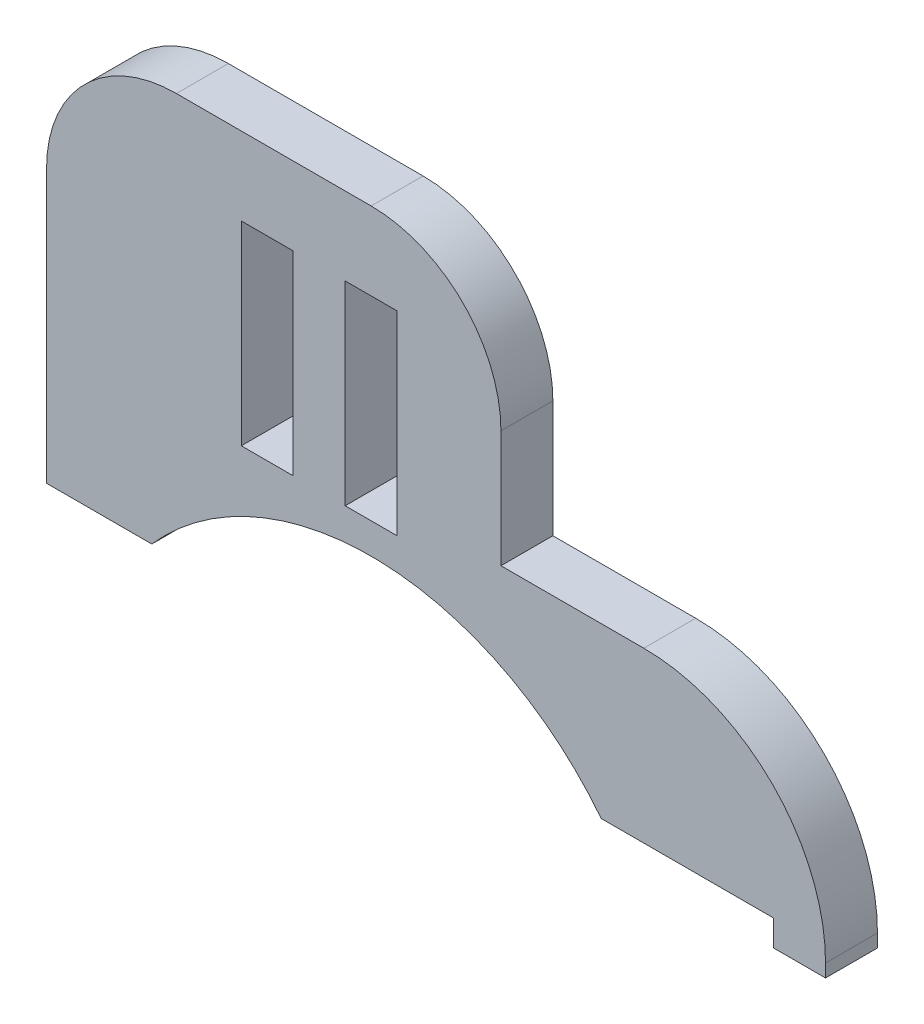
ISO-10303-21;
HEADER;
FILE_DESCRIPTION(('STEP AP214'),'2;1');
FILE_NAME('part.step','',(''),(''),'','','');
FILE_SCHEMA(('AUTOMOTIVE_DESIGN { 1 0 10303 214 1 1 1 1 }'));
ENDSEC;
DATA;
#1=APPLICATION_CONTEXT('core data for automotive mechanical design processes');
#2=APPLICATION_PROTOCOL_DEFINITION('international standard','automotive_design',2000,#1);
#3=PRODUCT_CONTEXT('',#1,'mechanical');
#4=PRODUCT('Part','Part','',(#3));
#5=PRODUCT_RELATED_PRODUCT_CATEGORY('part','',(#4));
#6=PRODUCT_DEFINITION_FORMATION('','',#4);
#7=PRODUCT_DEFINITION_CONTEXT('part definition',#1,'design');
#8=PRODUCT_DEFINITION('design','',#6,#7);
#9=PRODUCT_DEFINITION_SHAPE('','',#8);
#10=(LENGTH_UNIT() NAMED_UNIT(*) SI_UNIT(.MILLI.,.METRE.));
#11=(NAMED_UNIT(*) PLANE_ANGLE_UNIT() SI_UNIT($,.RADIAN.));
#12=(NAMED_UNIT(*) SI_UNIT($,.STERADIAN.) SOLID_ANGLE_UNIT());
#13=UNCERTAINTY_MEASURE_WITH_UNIT(LENGTH_MEASURE(1.E-05),#10,'distance_accuracy_value','');
#14=(GEOMETRIC_REPRESENTATION_CONTEXT(3) GLOBAL_UNCERTAINTY_ASSIGNED_CONTEXT((#13)) GLOBAL_UNIT_ASSIGNED_CONTEXT((#10,
#11,#12)) REPRESENTATION_CONTEXT('',''));
#15=CARTESIAN_POINT('',(0.,0.,0.));
#16=DIRECTION('',(0.,0.,1.));
#17=DIRECTION('',(1.,0.,0.));
#18=AXIS2_PLACEMENT_3D('',#15,#16,#17);
#19=CARTESIAN_POINT('',(-38.1,-7.62,5.08));
#20=DIRECTION('',(0.,1.,0.));
#21=DIRECTION('',(0.,0.,1.));
#22=AXIS2_PLACEMENT_3D('',#19,#20,#21);
#23=PLANE('',#22);
#24=DIRECTION('',(1.,0.,0.));
#25=VECTOR('',#24,1.);
#26=CARTESIAN_POINT('',(-38.1,-7.62,0.));
#27=LINE('',#26,#25);
#28=CARTESIAN_POINT('',(-38.1,-7.62,0.));
#29=VERTEX_POINT('',#28);
#30=CARTESIAN_POINT('',(-27.8037875443941,-7.62000000000001,0.));
#31=VERTEX_POINT('',#30);
#32=EDGE_CURVE('E307',#29,#31,#27,.T.);
#33=ORIENTED_EDGE('',*,*,#32,.T.);
#34=DIRECTION('',(0.,0.,1.));
#35=VECTOR('',#34,1.);
#36=CARTESIAN_POINT('',(-27.8037875443941,-7.62,0.));
#37=LINE('',#36,#35);
#38=CARTESIAN_POINT('',(-27.8037875443941,-7.62,5.08));
#39=VERTEX_POINT('',#38);
#40=EDGE_CURVE('E206',#31,#39,#37,.T.);
#41=ORIENTED_EDGE('',*,*,#40,.T.);
#42=DIRECTION('',(1.,0.,0.));
#43=VECTOR('',#42,1.);
#44=CARTESIAN_POINT('',(-38.1,-7.62,5.08));
#45=LINE('',#44,#43);
#46=CARTESIAN_POINT('',(-38.1,-7.62,5.08));
#47=VERTEX_POINT('',#46);
#48=EDGE_CURVE('E197',#47,#39,#45,.T.);
#49=ORIENTED_EDGE('',*,*,#48,.F.);
#50=DIRECTION('',(0.,0.,-1.));
#51=VECTOR('',#50,1.);
#52=CARTESIAN_POINT('',(-38.1,-7.62,5.08));
#53=LINE('',#52,#51);
#54=EDGE_CURVE('E312',#47,#29,#53,.T.);
#55=ORIENTED_EDGE('',*,*,#54,.T.);
#56=EDGE_LOOP('',(#33,#41,#49,#55));
#57=FACE_BOUND('',#56,.T.);
#58=ADVANCED_FACE('F35',(#57),#23,.F.);
#59=CARTESIAN_POINT('',(33.02,-11.43,0.));
#60=DIRECTION('',(1.,0.,0.));
#61=DIRECTION('',(0.,0.,-1.));
#62=AXIS2_PLACEMENT_3D('',#59,#60,#61);
#63=PLANE('',#62);
#64=DIRECTION('',(0.,0.,1.));
#65=VECTOR('',#64,1.);
#66=CARTESIAN_POINT('',(33.02,-8.89,5.08));
#67=LINE('',#66,#65);
#68=CARTESIAN_POINT('',(33.02,-8.89,0.));
#69=VERTEX_POINT('',#68);
#70=CARTESIAN_POINT('',(33.02,-8.89,5.08));
#71=VERTEX_POINT('',#70);
#72=EDGE_CURVE('E201',#69,#71,#67,.T.);
#73=ORIENTED_EDGE('',*,*,#72,.F.);
#74=DIRECTION('',(0.,1.,0.));
#75=VECTOR('',#74,1.);
#76=CARTESIAN_POINT('',(33.02,-11.43,0.));
#77=LINE('',#76,#75);
#78=CARTESIAN_POINT('',(33.02,-11.43,0.));
#79=VERTEX_POINT('',#78);
#80=EDGE_CURVE('E219',#79,#69,#77,.T.);
#81=ORIENTED_EDGE('',*,*,#80,.F.);
#82=DIRECTION('',(0.,0.,-1.));
#83=VECTOR('',#82,1.);
#84=CARTESIAN_POINT('',(33.02,-11.43,0.));
#85=LINE('',#84,#83);
#86=CARTESIAN_POINT('',(33.02,-11.43,5.08));
#87=VERTEX_POINT('',#86);
#88=EDGE_CURVE('E214',#87,#79,#85,.T.);
#89=ORIENTED_EDGE('',*,*,#88,.F.);
#90=DIRECTION('',(0.,1.,0.));
#91=VECTOR('',#90,1.);
#92=CARTESIAN_POINT('',(33.02,-11.43,5.08));
#93=LINE('',#92,#91);
#94=EDGE_CURVE('E222',#87,#71,#93,.T.);
#95=ORIENTED_EDGE('',*,*,#94,.T.);
#96=EDGE_LOOP('',(#73,#81,#89,#95));
#97=FACE_BOUND('',#96,.T.);
#98=ADVANCED_FACE('F379',(#97),#63,.F.);
#99=CARTESIAN_POINT('',(-38.1,7.62,5.08));
#100=DIRECTION('',(0.,-1.,0.));
#101=DIRECTION('',(0.,0.,-1.));
#102=AXIS2_PLACEMENT_3D('',#99,#100,#101);
#103=PLANE('',#102);
#104=DIRECTION('',(-1.,0.,0.));
#105=VECTOR('',#104,1.);
#106=CARTESIAN_POINT('',(-38.1,7.62,5.08));
#107=LINE('',#106,#105);
#108=CARTESIAN_POINT('',(20.32,7.62,5.08));
#109=VERTEX_POINT('',#108);
#110=CARTESIAN_POINT('',(6.35,7.62,5.08));
#111=VERTEX_POINT('',#110);
#112=EDGE_CURVE('E306',#109,#111,#107,.T.);
#113=ORIENTED_EDGE('',*,*,#112,.F.);
#114=DIRECTION('',(0.,0.,-1.));
#115=VECTOR('',#114,1.);
#116=CARTESIAN_POINT('',(20.32,7.62,5.08));
#117=LINE('',#116,#115);
#118=CARTESIAN_POINT('',(20.32,7.62,0.));
#119=VERTEX_POINT('',#118);
#120=EDGE_CURVE('E185',#109,#119,#117,.T.);
#121=ORIENTED_EDGE('',*,*,#120,.T.);
#122=DIRECTION('',(-1.,0.,0.));
#123=VECTOR('',#122,1.);
#124=CARTESIAN_POINT('',(-38.1,7.62,0.));
#125=LINE('',#124,#123);
#126=CARTESIAN_POINT('',(6.35,7.62,0.));
#127=VERTEX_POINT('',#126);
#128=EDGE_CURVE('E314',#119,#127,#125,.T.);
#129=ORIENTED_EDGE('',*,*,#128,.T.);
#130=DIRECTION('',(0.,0.,-1.));
#131=VECTOR('',#130,1.);
#132=CARTESIAN_POINT('',(6.35,7.62,5.08));
#133=LINE('',#132,#131);
#134=EDGE_CURVE('E300',#111,#127,#133,.T.);
#135=ORIENTED_EDGE('',*,*,#134,.F.);
#136=EDGE_LOOP('',(#113,#121,#129,#135));
#137=FACE_BOUND('',#136,.T.);
#138=ADVANCED_FACE('F344',(#137),#103,.F.);
#139=CARTESIAN_POINT('',(38.1,-7.62,5.08));
#140=DIRECTION('',(-1.,0.,0.));
#141=DIRECTION('',(0.,0.,1.));
#142=AXIS2_PLACEMENT_3D('',#139,#140,#141);
#143=PLANE('',#142);
#144=DIRECTION('',(0.,1.,0.));
#145=VECTOR('',#144,1.);
#146=CARTESIAN_POINT('',(38.1,-7.62,0.));
#147=LINE('',#146,#145);
#148=CARTESIAN_POINT('',(38.1,-11.43,0.));
#149=VERTEX_POINT('',#148);
#150=CARTESIAN_POINT('',(38.1,-10.16,0.));
#151=VERTEX_POINT('',#150);
#152=EDGE_CURVE('E303',#149,#151,#147,.T.);
#153=ORIENTED_EDGE('',*,*,#152,.T.);
#154=DIRECTION('',(0.,0.,-1.));
#155=VECTOR('',#154,1.);
#156=CARTESIAN_POINT('',(38.1,-10.16,5.08));
#157=LINE('',#156,#155);
#158=CARTESIAN_POINT('',(38.1,-10.16,5.08));
#159=VERTEX_POINT('',#158);
#160=EDGE_CURVE('E43',#151,#159,#157,.F.);
#161=ORIENTED_EDGE('',*,*,#160,.T.);
#162=DIRECTION('',(0.,1.,0.));
#163=VECTOR('',#162,1.);
#164=CARTESIAN_POINT('',(38.1,-7.62,5.08));
#165=LINE('',#164,#163);
#166=CARTESIAN_POINT('',(38.1,-11.43,5.08));
#167=VERTEX_POINT('',#166);
#168=EDGE_CURVE('E304',#167,#159,#165,.T.);
#169=ORIENTED_EDGE('',*,*,#168,.F.);
#170=DIRECTION('',(0.,0.,1.));
#171=VECTOR('',#170,1.);
#172=CARTESIAN_POINT('',(38.1,-11.43,0.));
#173=LINE('',#172,#171);
#174=EDGE_CURVE('E204',#149,#167,#173,.T.);
#175=ORIENTED_EDGE('',*,*,#174,.F.);
#176=EDGE_LOOP('',(#153,#161,#169,#175));
#177=FACE_BOUND('',#176,.T.);
#178=ADVANCED_FACE('F385',(#177),#143,.F.);
#179=CARTESIAN_POINT('',(-38.1,-7.62,5.08));
#180=DIRECTION('',(1.,0.,0.));
#181=DIRECTION('',(0.,0.,-1.));
#182=AXIS2_PLACEMENT_3D('',#179,#180,#181);
#183=PLANE('',#182);
#184=DIRECTION('',(0.,-1.,0.));
#185=VECTOR('',#184,1.);
#186=CARTESIAN_POINT('',(-38.1,-7.62,5.08));
#187=LINE('',#186,#185);
#188=CARTESIAN_POINT('',(-38.1,19.05,5.08));
#189=VERTEX_POINT('',#188);
#190=EDGE_CURVE('E309',#189,#47,#187,.T.);
#191=ORIENTED_EDGE('',*,*,#190,.F.);
#192=DIRECTION('',(0.,0.,-1.));
#193=VECTOR('',#192,1.);
#194=CARTESIAN_POINT('',(-38.1,19.05,0.));
#195=LINE('',#194,#193);
#196=CARTESIAN_POINT('',(-38.1,19.05,0.));
#197=VERTEX_POINT('',#196);
#198=EDGE_CURVE('E322',#189,#197,#195,.T.);
#199=ORIENTED_EDGE('',*,*,#198,.T.);
#200=DIRECTION('',(0.,-1.,0.));
#201=VECTOR('',#200,1.);
#202=CARTESIAN_POINT('',(-38.1,-7.62,0.));
#203=LINE('',#202,#201);
#204=EDGE_CURVE('E316',#197,#29,#203,.T.);
#205=ORIENTED_EDGE('',*,*,#204,.T.);
#206=ORIENTED_EDGE('',*,*,#54,.F.);
#207=EDGE_LOOP('',(#191,#199,#205,#206));
#208=FACE_BOUND('',#207,.T.);
#209=ADVANCED_FACE('F372',(#208),#183,.F.);
#210=CARTESIAN_POINT('',(0.,0.,5.08));
#211=DIRECTION('',(0.,0.,-1.));
#212=DIRECTION('',(-1.,0.,0.));
#213=AXIS2_PLACEMENT_3D('',#210,#211,#212);
#214=PLANE('',#213);
#215=ORIENTED_EDGE('',*,*,#168,.T.);
#216=CARTESIAN_POINT('',(20.32,-10.16,5.08));
#217=DIRECTION('',(0.,0.,-1.));
#218=DIRECTION('',(-1.,0.,0.));
#219=AXIS2_PLACEMENT_3D('',#216,#217,#218);
#220=CIRCLE('',#219,17.78);
#221=EDGE_CURVE('E11',#159,#109,#220,.F.);
#222=ORIENTED_EDGE('',*,*,#221,.T.);
#223=ORIENTED_EDGE('',*,*,#112,.T.);
#224=DIRECTION('',(0.,-1.,0.));
#225=VECTOR('',#224,1.);
#226=CARTESIAN_POINT('',(6.35,31.75,5.08));
#227=LINE('',#226,#225);
#228=CARTESIAN_POINT('',(6.35,19.05,5.08));
#229=VERTEX_POINT('',#228);
#230=EDGE_CURVE('E294',#229,#111,#227,.T.);
#231=ORIENTED_EDGE('',*,*,#230,.F.);
#232=CARTESIAN_POINT('',(-6.35,19.05,5.08));
#233=DIRECTION('',(0.,0.,-1.));
#234=DIRECTION('',(-1.,0.,0.));
#235=AXIS2_PLACEMENT_3D('',#232,#233,#234);
#236=CIRCLE('',#235,12.7);
#237=CARTESIAN_POINT('',(-6.35,31.75,5.08));
#238=VERTEX_POINT('',#237);
#239=EDGE_CURVE('E334',#229,#238,#236,.F.);
#240=ORIENTED_EDGE('',*,*,#239,.T.);
#241=DIRECTION('',(1.,0.,0.));
#242=VECTOR('',#241,1.);
#243=CARTESIAN_POINT('',(-19.05,31.75,5.08));
#244=LINE('',#243,#242);
#245=CARTESIAN_POINT('',(-25.4,31.75,5.08));
#246=VERTEX_POINT('',#245);
#247=EDGE_CURVE('E291',#246,#238,#244,.T.);
#248=ORIENTED_EDGE('',*,*,#247,.F.);
#249=CARTESIAN_POINT('',(-25.4,19.05,5.08));
#250=DIRECTION('',(0.,0.,-1.));
#251=DIRECTION('',(-1.,0.,0.));
#252=AXIS2_PLACEMENT_3D('',#249,#250,#251);
#253=CIRCLE('',#252,12.7);
#254=EDGE_CURVE('E336',#246,#189,#253,.F.);
#255=ORIENTED_EDGE('',*,*,#254,.T.);
#256=ORIENTED_EDGE('',*,*,#190,.T.);
#257=ORIENTED_EDGE('',*,*,#48,.T.);
#258=CARTESIAN_POINT('',(-6.34999999999998,-26.495,5.08));
#259=DIRECTION('',(0.,0.,1.));
#260=DIRECTION('',(-1.,0.,0.));
#261=AXIS2_PLACEMENT_3D('',#258,#259,#260);
#262=CIRCLE('',#261,28.575);
#263=CARTESIAN_POINT('',(16.1576564750753,-8.89,5.08));
#264=VERTEX_POINT('',#263);
#265=EDGE_CURVE('E178',#264,#39,#262,.T.);
#266=ORIENTED_EDGE('',*,*,#265,.F.);
#267=DIRECTION('',(-1.,0.,0.));
#268=VECTOR('',#267,1.);
#269=CARTESIAN_POINT('',(33.02,-8.89,5.08));
#270=LINE('',#269,#268);
#271=EDGE_CURVE('E194',#71,#264,#270,.T.);
#272=ORIENTED_EDGE('',*,*,#271,.F.);
#273=ORIENTED_EDGE('',*,*,#94,.F.);
#274=DIRECTION('',(-1.,0.,0.));
#275=VECTOR('',#274,1.);
#276=CARTESIAN_POINT('',(38.1,-11.43,5.08));
#277=LINE('',#276,#275);
#278=EDGE_CURVE('E212',#167,#87,#277,.T.);
#279=ORIENTED_EDGE('',*,*,#278,.F.);
#280=EDGE_LOOP('',(#215,#222,#223,#231,#240,#248,#255,#256,#257,#266,#272,#273,#279));
#281=FACE_BOUND('',#280,.T.);
#282=DIRECTION('',(1.,0.,0.));
#283=VECTOR('',#282,1.);
#284=CARTESIAN_POINT('',(0.,24.13,5.08));
#285=LINE('',#284,#283);
#286=CARTESIAN_POINT('',(-19.05,24.13,5.08));
#287=VERTEX_POINT('',#286);
#288=CARTESIAN_POINT('',(-13.97,24.13,5.08));
#289=VERTEX_POINT('',#288);
#290=EDGE_CURVE('E250',#287,#289,#285,.T.);
#291=ORIENTED_EDGE('',*,*,#290,.T.);
#292=DIRECTION('',(0.,-1.,0.));
#293=VECTOR('',#292,1.);
#294=CARTESIAN_POINT('',(-13.97,0.,5.08));
#295=LINE('',#294,#293);
#296=CARTESIAN_POINT('',(-13.97,5.08,5.08));
#297=VERTEX_POINT('',#296);
#298=EDGE_CURVE('E253',#289,#297,#295,.T.);
#299=ORIENTED_EDGE('',*,*,#298,.T.);
#300=DIRECTION('',(-1.,0.,0.));
#301=VECTOR('',#300,1.);
#302=CARTESIAN_POINT('',(0.,5.08,5.08));
#303=LINE('',#302,#301);
#304=CARTESIAN_POINT('',(-19.05,5.08,5.08));
#305=VERTEX_POINT('',#304);
#306=EDGE_CURVE('E238',#297,#305,#303,.T.);
#307=ORIENTED_EDGE('',*,*,#306,.T.);
#308=DIRECTION('',(0.,1.,0.));
#309=VECTOR('',#308,1.);
#310=CARTESIAN_POINT('',(-19.05,0.,5.08));
#311=LINE('',#310,#309);
#312=EDGE_CURVE('E247',#305,#287,#311,.T.);
#313=ORIENTED_EDGE('',*,*,#312,.T.);
#314=EDGE_LOOP('',(#291,#299,#307,#313));
#315=FACE_BOUND('',#314,.T.);
#316=DIRECTION('',(1.,0.,0.));
#317=VECTOR('',#316,1.);
#318=CARTESIAN_POINT('',(0.,24.13,5.08));
#319=LINE('',#318,#317);
#320=CARTESIAN_POINT('',(-8.88999999999998,24.13,5.08));
#321=VERTEX_POINT('',#320);
#322=CARTESIAN_POINT('',(-3.80999999999998,24.13,5.08));
#323=VERTEX_POINT('',#322);
#324=EDGE_CURVE('E282',#321,#323,#319,.T.);
#325=ORIENTED_EDGE('',*,*,#324,.T.);
#326=DIRECTION('',(0.,-1.,0.));
#327=VECTOR('',#326,1.);
#328=CARTESIAN_POINT('',(-3.80999999999999,0.,5.08));
#329=LINE('',#328,#327);
#330=CARTESIAN_POINT('',(-3.80999999999999,5.08,5.08));
#331=VERTEX_POINT('',#330);
#332=EDGE_CURVE('E285',#323,#331,#329,.T.);
#333=ORIENTED_EDGE('',*,*,#332,.T.);
#334=DIRECTION('',(-1.,0.,0.));
#335=VECTOR('',#334,1.);
#336=CARTESIAN_POINT('',(0.,5.08,5.08));
#337=LINE('',#336,#335);
#338=CARTESIAN_POINT('',(-8.88999999999998,5.08,5.08));
#339=VERTEX_POINT('',#338);
#340=EDGE_CURVE('E270',#331,#339,#337,.T.);
#341=ORIENTED_EDGE('',*,*,#340,.T.);
#342=DIRECTION('',(0.,1.,0.));
#343=VECTOR('',#342,1.);
#344=CARTESIAN_POINT('',(-8.88999999999998,0.,5.08));
#345=LINE('',#344,#343);
#346=EDGE_CURVE('E279',#339,#321,#345,.T.);
#347=ORIENTED_EDGE('',*,*,#346,.T.);
#348=EDGE_LOOP('',(#325,#333,#341,#347));
#349=FACE_BOUND('',#348,.T.);
#350=ADVANCED_FACE('F191',(#281,#315,#349),#214,.F.);
#351=CARTESIAN_POINT('',(0.,0.,0.));
#352=DIRECTION('',(0.,0.,-1.));
#353=DIRECTION('',(-1.,0.,0.));
#354=AXIS2_PLACEMENT_3D('',#351,#352,#353);
#355=PLANE('',#354);
#356=ORIENTED_EDGE('',*,*,#128,.F.);
#357=CARTESIAN_POINT('',(20.32,-10.16,0.));
#358=DIRECTION('',(0.,0.,-1.));
#359=DIRECTION('',(-1.,0.,0.));
#360=AXIS2_PLACEMENT_3D('',#357,#358,#359);
#361=CIRCLE('',#360,17.78);
#362=EDGE_CURVE('E57',#119,#151,#361,.T.);
#363=ORIENTED_EDGE('',*,*,#362,.T.);
#364=ORIENTED_EDGE('',*,*,#152,.F.);
#365=DIRECTION('',(1.,0.,0.));
#366=VECTOR('',#365,1.);
#367=CARTESIAN_POINT('',(38.1,-11.43,0.));
#368=LINE('',#367,#366);
#369=EDGE_CURVE('E216',#79,#149,#368,.T.);
#370=ORIENTED_EDGE('',*,*,#369,.F.);
#371=ORIENTED_EDGE('',*,*,#80,.T.);
#372=DIRECTION('',(1.,0.,0.));
#373=VECTOR('',#372,1.);
#374=CARTESIAN_POINT('',(33.02,-8.89,0.));
#375=LINE('',#374,#373);
#376=CARTESIAN_POINT('',(16.1576564750753,-8.89,0.));
#377=VERTEX_POINT('',#376);
#378=EDGE_CURVE('E202',#377,#69,#375,.T.);
#379=ORIENTED_EDGE('',*,*,#378,.F.);
#380=CARTESIAN_POINT('',(-6.34999999999998,-26.495,0.));
#381=DIRECTION('',(0.,0.,1.));
#382=DIRECTION('',(-1.,0.,0.));
#383=AXIS2_PLACEMENT_3D('',#380,#381,#382);
#384=CIRCLE('',#383,28.575);
#385=EDGE_CURVE('E181',#377,#31,#384,.T.);
#386=ORIENTED_EDGE('',*,*,#385,.T.);
#387=ORIENTED_EDGE('',*,*,#32,.F.);
#388=ORIENTED_EDGE('',*,*,#204,.F.);
#389=CARTESIAN_POINT('',(-25.4,19.05,0.));
#390=DIRECTION('',(0.,0.,-1.));
#391=DIRECTION('',(-1.,0.,0.));
#392=AXIS2_PLACEMENT_3D('',#389,#390,#391);
#393=CIRCLE('',#392,12.7);
#394=CARTESIAN_POINT('',(-25.4,31.75,0.));
#395=VERTEX_POINT('',#394);
#396=EDGE_CURVE('E327',#197,#395,#393,.T.);
#397=ORIENTED_EDGE('',*,*,#396,.T.);
#398=DIRECTION('',(-1.,0.,0.));
#399=VECTOR('',#398,1.);
#400=CARTESIAN_POINT('',(-19.05,31.75,0.));
#401=LINE('',#400,#399);
#402=CARTESIAN_POINT('',(-6.35,31.75,0.));
#403=VERTEX_POINT('',#402);
#404=EDGE_CURVE('E288',#403,#395,#401,.T.);
#405=ORIENTED_EDGE('',*,*,#404,.F.);
#406=CARTESIAN_POINT('',(-6.35,19.05,0.));
#407=DIRECTION('',(0.,0.,-1.));
#408=DIRECTION('',(-1.,0.,0.));
#409=AXIS2_PLACEMENT_3D('',#406,#407,#408);
#410=CIRCLE('',#409,12.7);
#411=CARTESIAN_POINT('',(6.35,19.05,0.));
#412=VERTEX_POINT('',#411);
#413=EDGE_CURVE('E325',#403,#412,#410,.T.);
#414=ORIENTED_EDGE('',*,*,#413,.T.);
#415=DIRECTION('',(0.,-1.,0.));
#416=VECTOR('',#415,1.);
#417=CARTESIAN_POINT('',(6.35,31.75,0.));
#418=LINE('',#417,#416);
#419=EDGE_CURVE('E297',#412,#127,#418,.T.);
#420=ORIENTED_EDGE('',*,*,#419,.T.);
#421=EDGE_LOOP('',(#356,#363,#364,#370,#371,#379,#386,#387,#388,#397,#405,#414,#420));
#422=FACE_BOUND('',#421,.T.);
#423=DIRECTION('',(0.,-1.,0.));
#424=VECTOR('',#423,1.);
#425=CARTESIAN_POINT('',(-13.97,5.08,0.));
#426=LINE('',#425,#424);
#427=CARTESIAN_POINT('',(-13.97,24.13,0.));
#428=VERTEX_POINT('',#427);
#429=CARTESIAN_POINT('',(-13.97,5.08,0.));
#430=VERTEX_POINT('',#429);
#431=EDGE_CURVE('E224',#428,#430,#426,.T.);
#432=ORIENTED_EDGE('',*,*,#431,.F.);
#433=DIRECTION('',(1.,0.,0.));
#434=VECTOR('',#433,1.);
#435=CARTESIAN_POINT('',(-13.97,24.13,0.));
#436=LINE('',#435,#434);
#437=CARTESIAN_POINT('',(-19.05,24.13,0.));
#438=VERTEX_POINT('',#437);
#439=EDGE_CURVE('E232',#438,#428,#436,.T.);
#440=ORIENTED_EDGE('',*,*,#439,.F.);
#441=DIRECTION('',(0.,1.,0.));
#442=VECTOR('',#441,1.);
#443=CARTESIAN_POINT('',(-19.05,5.08,0.));
#444=LINE('',#443,#442);
#445=CARTESIAN_POINT('',(-19.05,5.08,0.));
#446=VERTEX_POINT('',#445);
#447=EDGE_CURVE('E229',#446,#438,#444,.T.);
#448=ORIENTED_EDGE('',*,*,#447,.F.);
#449=DIRECTION('',(-1.,0.,0.));
#450=VECTOR('',#449,1.);
#451=CARTESIAN_POINT('',(-13.97,5.08,0.));
#452=LINE('',#451,#450);
#453=EDGE_CURVE('E226',#430,#446,#452,.T.);
#454=ORIENTED_EDGE('',*,*,#453,.F.);
#455=EDGE_LOOP('',(#432,#440,#448,#454));
#456=FACE_BOUND('',#455,.T.);
#457=DIRECTION('',(0.,-1.,0.));
#458=VECTOR('',#457,1.);
#459=CARTESIAN_POINT('',(-3.80999999999998,24.13,0.));
#460=LINE('',#459,#458);
#461=CARTESIAN_POINT('',(-3.80999999999998,24.13,0.));
#462=VERTEX_POINT('',#461);
#463=CARTESIAN_POINT('',(-3.80999999999999,5.08,0.));
#464=VERTEX_POINT('',#463);
#465=EDGE_CURVE('E256',#462,#464,#460,.T.);
#466=ORIENTED_EDGE('',*,*,#465,.F.);
#467=DIRECTION('',(1.,0.,0.));
#468=VECTOR('',#467,1.);
#469=CARTESIAN_POINT('',(-8.88999999999998,24.13,0.));
#470=LINE('',#469,#468);
#471=CARTESIAN_POINT('',(-8.88999999999998,24.13,0.));
#472=VERTEX_POINT('',#471);
#473=EDGE_CURVE('E264',#472,#462,#470,.T.);
#474=ORIENTED_EDGE('',*,*,#473,.F.);
#475=DIRECTION('',(0.,1.,0.));
#476=VECTOR('',#475,1.);
#477=CARTESIAN_POINT('',(-8.88999999999998,24.13,0.));
#478=LINE('',#477,#476);
#479=CARTESIAN_POINT('',(-8.88999999999998,5.08,0.));
#480=VERTEX_POINT('',#479);
#481=EDGE_CURVE('E261',#480,#472,#478,.T.);
#482=ORIENTED_EDGE('',*,*,#481,.F.);
#483=DIRECTION('',(-1.,0.,0.));
#484=VECTOR('',#483,1.);
#485=CARTESIAN_POINT('',(-8.88999999999998,5.08,0.));
#486=LINE('',#485,#484);
#487=EDGE_CURVE('E258',#464,#480,#486,.T.);
#488=ORIENTED_EDGE('',*,*,#487,.F.);
#489=EDGE_LOOP('',(#466,#474,#482,#488));
#490=FACE_BOUND('',#489,.T.);
#491=ADVANCED_FACE('F348',(#422,#456,#490),#355,.T.);
#492=CARTESIAN_POINT('',(6.35,31.75,0.));
#493=DIRECTION('',(-1.,0.,0.));
#494=DIRECTION('',(0.,0.,1.));
#495=AXIS2_PLACEMENT_3D('',#492,#493,#494);
#496=PLANE('',#495);
#497=ORIENTED_EDGE('',*,*,#419,.F.);
#498=DIRECTION('',(0.,0.,-1.));
#499=VECTOR('',#498,1.);
#500=CARTESIAN_POINT('',(6.35,19.05,5.08));
#501=LINE('',#500,#499);
#502=EDGE_CURVE('E186',#412,#229,#501,.F.);
#503=ORIENTED_EDGE('',*,*,#502,.T.);
#504=ORIENTED_EDGE('',*,*,#230,.T.);
#505=ORIENTED_EDGE('',*,*,#134,.T.);
#506=EDGE_LOOP('',(#497,#503,#504,#505));
#507=FACE_BOUND('',#506,.T.);
#508=ADVANCED_FACE('F354',(#507),#496,.F.);
#509=CARTESIAN_POINT('',(0.,31.75,0.));
#510=DIRECTION('',(0.,1.,0.));
#511=DIRECTION('',(0.,0.,1.));
#512=AXIS2_PLACEMENT_3D('',#509,#510,#511);
#513=PLANE('',#512);
#514=ORIENTED_EDGE('',*,*,#404,.T.);
#515=DIRECTION('',(0.,0.,-1.));
#516=VECTOR('',#515,1.);
#517=CARTESIAN_POINT('',(-25.4,31.75,5.08000000000001));
#518=LINE('',#517,#516);
#519=EDGE_CURVE('E332',#395,#246,#518,.F.);
#520=ORIENTED_EDGE('',*,*,#519,.T.);
#521=ORIENTED_EDGE('',*,*,#247,.T.);
#522=DIRECTION('',(0.,0.,-1.));
#523=VECTOR('',#522,1.);
#524=CARTESIAN_POINT('',(-6.35,31.75,0.));
#525=LINE('',#524,#523);
#526=EDGE_CURVE('E329',#238,#403,#525,.T.);
#527=ORIENTED_EDGE('',*,*,#526,.T.);
#528=EDGE_LOOP('',(#514,#520,#521,#527));
#529=FACE_BOUND('',#528,.T.);
#530=ADVANCED_FACE('F362',(#529),#513,.T.);
#531=CARTESIAN_POINT('',(-3.80999999999998,24.13,50.8));
#532=DIRECTION('',(1.,0.,0.));
#533=DIRECTION('',(0.,1.,0.));
#534=AXIS2_PLACEMENT_3D('',#531,#532,#533);
#535=PLANE('',#534);
#536=DIRECTION('',(0.,0.,-1.));
#537=VECTOR('',#536,1.);
#538=CARTESIAN_POINT('',(-3.80999999999998,24.13,50.8));
#539=LINE('',#538,#537);
#540=EDGE_CURVE('E268',#323,#462,#539,.T.);
#541=ORIENTED_EDGE('',*,*,#540,.T.);
#542=ORIENTED_EDGE('',*,*,#465,.T.);
#543=DIRECTION('',(0.,0.,-1.));
#544=VECTOR('',#543,1.);
#545=CARTESIAN_POINT('',(-3.80999999999999,5.08,50.8));
#546=LINE('',#545,#544);
#547=EDGE_CURVE('E267',#331,#464,#546,.T.);
#548=ORIENTED_EDGE('',*,*,#547,.F.);
#549=ORIENTED_EDGE('',*,*,#332,.F.);
#550=EDGE_LOOP('',(#541,#542,#548,#549));
#551=FACE_BOUND('',#550,.T.);
#552=ADVANCED_FACE('F438',(#551),#535,.F.);
#553=CARTESIAN_POINT('',(-8.88999999999998,24.13,50.8));
#554=DIRECTION('',(0.,1.,0.));
#555=DIRECTION('',(0.,0.,1.));
#556=AXIS2_PLACEMENT_3D('',#553,#554,#555);
#557=PLANE('',#556);
#558=DIRECTION('',(0.,0.,-1.));
#559=VECTOR('',#558,1.);
#560=CARTESIAN_POINT('',(-8.88999999999998,24.13,50.8));
#561=LINE('',#560,#559);
#562=EDGE_CURVE('E271',#321,#472,#561,.T.);
#563=ORIENTED_EDGE('',*,*,#562,.T.);
#564=ORIENTED_EDGE('',*,*,#473,.T.);
#565=ORIENTED_EDGE('',*,*,#540,.F.);
#566=ORIENTED_EDGE('',*,*,#324,.F.);
#567=EDGE_LOOP('',(#563,#564,#565,#566));
#568=FACE_BOUND('',#567,.T.);
#569=ADVANCED_FACE('F434',(#568),#557,.F.);
#570=CARTESIAN_POINT('',(-8.88999999999998,24.13,50.8));
#571=DIRECTION('',(-1.,0.,0.));
#572=DIRECTION('',(0.,-1.,0.));
#573=AXIS2_PLACEMENT_3D('',#570,#571,#572);
#574=PLANE('',#573);
#575=DIRECTION('',(0.,0.,-1.));
#576=VECTOR('',#575,1.);
#577=CARTESIAN_POINT('',(-8.88999999999998,5.08,50.8));
#578=LINE('',#577,#576);
#579=EDGE_CURVE('E273',#339,#480,#578,.T.);
#580=ORIENTED_EDGE('',*,*,#579,.T.);
#581=ORIENTED_EDGE('',*,*,#481,.T.);
#582=ORIENTED_EDGE('',*,*,#562,.F.);
#583=ORIENTED_EDGE('',*,*,#346,.F.);
#584=EDGE_LOOP('',(#580,#581,#582,#583));
#585=FACE_BOUND('',#584,.T.);
#586=ADVANCED_FACE('F437',(#585),#574,.F.);
#587=CARTESIAN_POINT('',(-8.88999999999998,5.08,50.8));
#588=DIRECTION('',(0.,-1.,0.));
#589=DIRECTION('',(0.,0.,-1.));
#590=AXIS2_PLACEMENT_3D('',#587,#588,#589);
#591=PLANE('',#590);
#592=ORIENTED_EDGE('',*,*,#547,.T.);
#593=ORIENTED_EDGE('',*,*,#487,.T.);
#594=ORIENTED_EDGE('',*,*,#579,.F.);
#595=ORIENTED_EDGE('',*,*,#340,.F.);
#596=EDGE_LOOP('',(#592,#593,#594,#595));
#597=FACE_BOUND('',#596,.T.);
#598=ADVANCED_FACE('F432',(#597),#591,.F.);
#599=CARTESIAN_POINT('',(-13.97,5.08,19.05));
#600=DIRECTION('',(1.,0.,0.));
#601=DIRECTION('',(0.,0.,-1.));
#602=AXIS2_PLACEMENT_3D('',#599,#600,#601);
#603=PLANE('',#602);
#604=DIRECTION('',(0.,0.,-1.));
#605=VECTOR('',#604,1.);
#606=CARTESIAN_POINT('',(-13.97,24.13,19.05));
#607=LINE('',#606,#605);
#608=EDGE_CURVE('E236',#289,#428,#607,.T.);
#609=ORIENTED_EDGE('',*,*,#608,.T.);
#610=ORIENTED_EDGE('',*,*,#431,.T.);
#611=DIRECTION('',(0.,0.,-1.));
#612=VECTOR('',#611,1.);
#613=CARTESIAN_POINT('',(-13.97,5.08,19.05));
#614=LINE('',#613,#612);
#615=EDGE_CURVE('E235',#297,#430,#614,.T.);
#616=ORIENTED_EDGE('',*,*,#615,.F.);
#617=ORIENTED_EDGE('',*,*,#298,.F.);
#618=EDGE_LOOP('',(#609,#610,#616,#617));
#619=FACE_BOUND('',#618,.T.);
#620=ADVANCED_FACE('F422',(#619),#603,.F.);
#621=CARTESIAN_POINT('',(-13.97,24.13,19.05));
#622=DIRECTION('',(0.,1.,0.));
#623=DIRECTION('',(-1.,0.,0.));
#624=AXIS2_PLACEMENT_3D('',#621,#622,#623);
#625=PLANE('',#624);
#626=DIRECTION('',(0.,0.,-1.));
#627=VECTOR('',#626,1.);
#628=CARTESIAN_POINT('',(-19.05,24.13,19.05));
#629=LINE('',#628,#627);
#630=EDGE_CURVE('E239',#287,#438,#629,.T.);
#631=ORIENTED_EDGE('',*,*,#630,.T.);
#632=ORIENTED_EDGE('',*,*,#439,.T.);
#633=ORIENTED_EDGE('',*,*,#608,.F.);
#634=ORIENTED_EDGE('',*,*,#290,.F.);
#635=EDGE_LOOP('',(#631,#632,#633,#634));
#636=FACE_BOUND('',#635,.T.);
#637=ADVANCED_FACE('F418',(#636),#625,.F.);
#638=CARTESIAN_POINT('',(-19.05,5.08,19.05));
#639=DIRECTION('',(-1.,0.,0.));
#640=DIRECTION('',(0.,0.,1.));
#641=AXIS2_PLACEMENT_3D('',#638,#639,#640);
#642=PLANE('',#641);
#643=DIRECTION('',(0.,0.,-1.));
#644=VECTOR('',#643,1.);
#645=CARTESIAN_POINT('',(-19.05,5.08,19.05));
#646=LINE('',#645,#644);
#647=EDGE_CURVE('E241',#305,#446,#646,.T.);
#648=ORIENTED_EDGE('',*,*,#647,.T.);
#649=ORIENTED_EDGE('',*,*,#447,.T.);
#650=ORIENTED_EDGE('',*,*,#630,.F.);
#651=ORIENTED_EDGE('',*,*,#312,.F.);
#652=EDGE_LOOP('',(#648,#649,#650,#651));
#653=FACE_BOUND('',#652,.T.);
#654=ADVANCED_FACE('F421',(#653),#642,.F.);
#655=CARTESIAN_POINT('',(-13.97,5.08,19.05));
#656=DIRECTION('',(0.,-1.,0.));
#657=DIRECTION('',(0.,0.,-1.));
#658=AXIS2_PLACEMENT_3D('',#655,#656,#657);
#659=PLANE('',#658);
#660=ORIENTED_EDGE('',*,*,#615,.T.);
#661=ORIENTED_EDGE('',*,*,#453,.T.);
#662=ORIENTED_EDGE('',*,*,#647,.F.);
#663=ORIENTED_EDGE('',*,*,#306,.F.);
#664=EDGE_LOOP('',(#660,#661,#662,#663));
#665=FACE_BOUND('',#664,.T.);
#666=ADVANCED_FACE('F407',(#665),#659,.F.);
#667=CARTESIAN_POINT('',(-25.4,19.05,5.08));
#668=DIRECTION('',(0.,0.,1.));
#669=DIRECTION('',(1.,0.,0.));
#670=AXIS2_PLACEMENT_3D('',#667,#668,#669);
#671=CYLINDRICAL_SURFACE('',#670,12.7);
#672=ORIENTED_EDGE('',*,*,#254,.F.);
#673=ORIENTED_EDGE('',*,*,#519,.F.);
#674=ORIENTED_EDGE('',*,*,#396,.F.);
#675=ORIENTED_EDGE('',*,*,#198,.F.);
#676=EDGE_LOOP('',(#672,#673,#674,#675));
#677=FACE_BOUND('',#676,.T.);
#678=ADVANCED_FACE('F369',(#677),#671,.T.);
#679=CARTESIAN_POINT('',(-6.35,19.05,0.));
#680=DIRECTION('',(0.,0.,1.));
#681=DIRECTION('',(1.,0.,0.));
#682=AXIS2_PLACEMENT_3D('',#679,#680,#681);
#683=CYLINDRICAL_SURFACE('',#682,12.7);
#684=ORIENTED_EDGE('',*,*,#239,.F.);
#685=ORIENTED_EDGE('',*,*,#502,.F.);
#686=ORIENTED_EDGE('',*,*,#413,.F.);
#687=ORIENTED_EDGE('',*,*,#526,.F.);
#688=EDGE_LOOP('',(#684,#685,#686,#687));
#689=FACE_BOUND('',#688,.T.);
#690=ADVANCED_FACE('F360',(#689),#683,.T.);
#691=CARTESIAN_POINT('',(0.,-11.43,0.));
#692=DIRECTION('',(0.,-1.,0.));
#693=DIRECTION('',(0.,0.,-1.));
#694=AXIS2_PLACEMENT_3D('',#691,#692,#693);
#695=PLANE('',#694);
#696=ORIENTED_EDGE('',*,*,#174,.T.);
#697=ORIENTED_EDGE('',*,*,#278,.T.);
#698=ORIENTED_EDGE('',*,*,#88,.T.);
#699=ORIENTED_EDGE('',*,*,#369,.T.);
#700=EDGE_LOOP('',(#696,#697,#698,#699));
#701=FACE_BOUND('',#700,.T.);
#702=ADVANCED_FACE('F384',(#701),#695,.T.);
#703=CARTESIAN_POINT('',(0.,-8.89,0.));
#704=DIRECTION('',(0.,1.,0.));
#705=DIRECTION('',(0.,0.,1.));
#706=AXIS2_PLACEMENT_3D('',#703,#704,#705);
#707=PLANE('',#706);
#708=ORIENTED_EDGE('',*,*,#271,.T.);
#709=DIRECTION('',(0.,0.,1.));
#710=VECTOR('',#709,1.);
#711=CARTESIAN_POINT('',(16.1576564750753,-8.89,0.));
#712=LINE('',#711,#710);
#713=EDGE_CURVE('E175',#264,#377,#712,.F.);
#714=ORIENTED_EDGE('',*,*,#713,.T.);
#715=ORIENTED_EDGE('',*,*,#378,.T.);
#716=ORIENTED_EDGE('',*,*,#72,.T.);
#717=EDGE_LOOP('',(#708,#714,#715,#716));
#718=FACE_BOUND('',#717,.T.);
#719=ADVANCED_FACE('F199',(#718),#707,.F.);
#720=CARTESIAN_POINT('',(-6.34999999999998,-26.495,0.));
#721=DIRECTION('',(0.,0.,1.));
#722=DIRECTION('',(1.,0.,0.));
#723=AXIS2_PLACEMENT_3D('',#720,#721,#722);
#724=CYLINDRICAL_SURFACE('',#723,28.575);
#725=ORIENTED_EDGE('',*,*,#385,.F.);
#726=ORIENTED_EDGE('',*,*,#713,.F.);
#727=ORIENTED_EDGE('',*,*,#265,.T.);
#728=ORIENTED_EDGE('',*,*,#40,.F.);
#729=EDGE_LOOP('',(#725,#726,#727,#728));
#730=FACE_BOUND('',#729,.T.);
#731=ADVANCED_FACE('F177',(#730),#724,.F.);
#732=CARTESIAN_POINT('',(20.32,-10.16,5.08));
#733=DIRECTION('',(0.,0.,-1.));
#734=DIRECTION('',(-1.,0.,0.));
#735=AXIS2_PLACEMENT_3D('',#732,#733,#734);
#736=CYLINDRICAL_SURFACE('',#735,17.78);
#737=ORIENTED_EDGE('',*,*,#221,.F.);
#738=ORIENTED_EDGE('',*,*,#160,.F.);
#739=ORIENTED_EDGE('',*,*,#362,.F.);
#740=ORIENTED_EDGE('',*,*,#120,.F.);
#741=EDGE_LOOP('',(#737,#738,#739,#740));
#742=FACE_BOUND('',#741,.T.);
#743=ADVANCED_FACE('F37',(#742),#736,.T.);
#744=CLOSED_SHELL('',(#58,#98,#138,#178,#209,#350,#491,#508,#530,#552,#569,#586,#598,#620,#637,
#654,#666,#678,#690,#702,#719,#731,#743));
#745=MANIFOLD_SOLID_BREP('B2',#744);
#746=ADVANCED_BREP_SHAPE_REPRESENTATION('',(#18,#745),#14);
#747=SHAPE_DEFINITION_REPRESENTATION(#9,#746);
ENDSEC;
END-ISO-10303-21;
